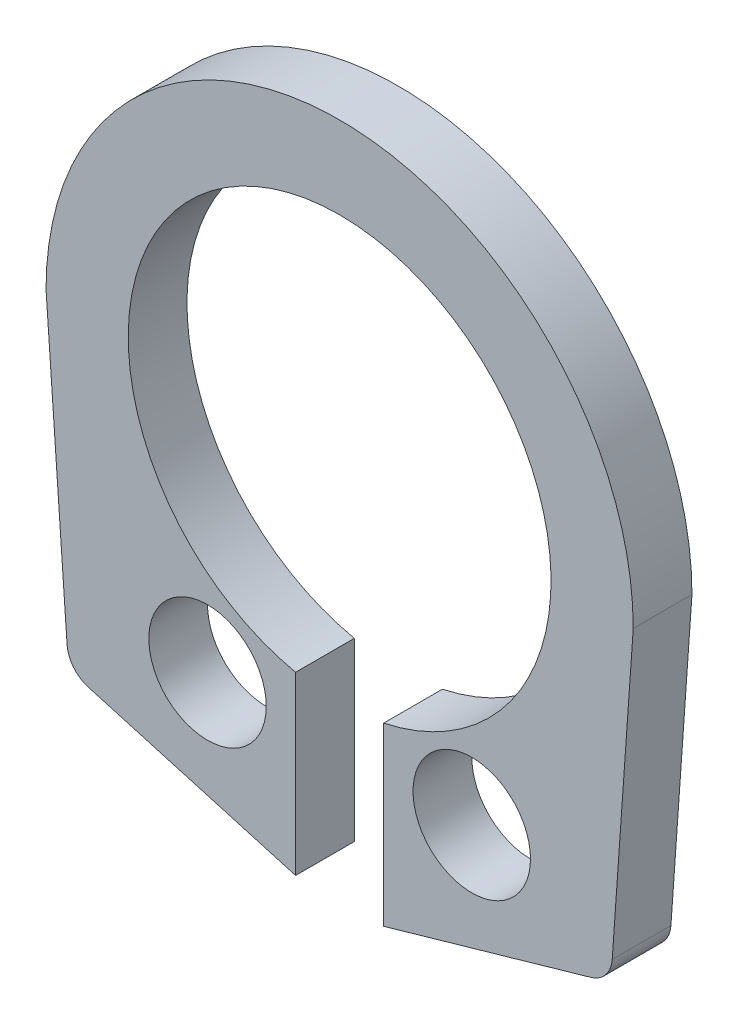
ISO-10303-21;
HEADER;
FILE_DESCRIPTION(('STEP AP214'),'2;1');
FILE_NAME('part.step','',(''),(''),'','','');
FILE_SCHEMA(('AUTOMOTIVE_DESIGN { 1 0 10303 214 1 1 1 1 }'));
ENDSEC;
DATA;
#1=APPLICATION_CONTEXT('core data for automotive mechanical design processes');
#2=APPLICATION_PROTOCOL_DEFINITION('international standard','automotive_design',2000,#1);
#3=PRODUCT_CONTEXT('',#1,'mechanical');
#4=PRODUCT('Part','Part','',(#3));
#5=PRODUCT_RELATED_PRODUCT_CATEGORY('part','',(#4));
#6=PRODUCT_DEFINITION_FORMATION('','',#4);
#7=PRODUCT_DEFINITION_CONTEXT('part definition',#1,'design');
#8=PRODUCT_DEFINITION('design','',#6,#7);
#9=PRODUCT_DEFINITION_SHAPE('','',#8);
#10=(LENGTH_UNIT() NAMED_UNIT(*) SI_UNIT(.MILLI.,.METRE.));
#11=(NAMED_UNIT(*) PLANE_ANGLE_UNIT() SI_UNIT($,.RADIAN.));
#12=(NAMED_UNIT(*) SI_UNIT($,.STERADIAN.) SOLID_ANGLE_UNIT());
#13=UNCERTAINTY_MEASURE_WITH_UNIT(LENGTH_MEASURE(1.E-05),#10,'distance_accuracy_value','');
#14=(GEOMETRIC_REPRESENTATION_CONTEXT(3) GLOBAL_UNCERTAINTY_ASSIGNED_CONTEXT((#13)) GLOBAL_UNIT_ASSIGNED_CONTEXT((#10,
#11,#12)) REPRESENTATION_CONTEXT('',''));
#15=CARTESIAN_POINT('',(0.,0.,0.));
#16=DIRECTION('',(0.,0.,1.));
#17=DIRECTION('',(1.,0.,0.));
#18=AXIS2_PLACEMENT_3D('',#15,#16,#17);
#19=CARTESIAN_POINT('',(0.,-0.57748458599427,1.));
#20=DIRECTION('',(0.,0.,-1.));
#21=DIRECTION('',(-1.,0.,0.));
#22=AXIS2_PLACEMENT_3D('',#19,#20,#21);
#23=CYLINDRICAL_SURFACE('',#22,5.);
#24=CARTESIAN_POINT('',(0.,-0.57748458599427,0.));
#25=DIRECTION('',(0.,0.,1.));
#26=DIRECTION('',(1.,0.,0.));
#27=AXIS2_PLACEMENT_3D('',#24,#25,#26);
#28=CIRCLE('',#27,5.);
#29=CARTESIAN_POINT('',(5.,-0.577484585994269,0.));
#30=VERTEX_POINT('',#29);
#31=CARTESIAN_POINT('',(-5.,-0.57748458599427,0.));
#32=VERTEX_POINT('',#31);
#33=EDGE_CURVE('E130',#30,#32,#28,.T.);
#34=ORIENTED_EDGE('',*,*,#33,.T.);
#35=DIRECTION('',(0.,0.,-1.));
#36=VECTOR('',#35,1.);
#37=CARTESIAN_POINT('',(-5.,-0.57748458599427,1.));
#38=LINE('',#37,#36);
#39=CARTESIAN_POINT('',(-5.,-0.57748458599427,1.));
#40=VERTEX_POINT('',#39);
#41=EDGE_CURVE('E114',#40,#32,#38,.T.);
#42=ORIENTED_EDGE('',*,*,#41,.F.);
#43=CARTESIAN_POINT('',(0.,-0.57748458599427,1.));
#44=DIRECTION('',(0.,0.,1.));
#45=DIRECTION('',(1.,0.,0.));
#46=AXIS2_PLACEMENT_3D('',#43,#44,#45);
#47=CIRCLE('',#46,5.);
#48=CARTESIAN_POINT('',(5.,-0.577484585994269,1.));
#49=VERTEX_POINT('',#48);
#50=EDGE_CURVE('E117',#49,#40,#47,.T.);
#51=ORIENTED_EDGE('',*,*,#50,.F.);
#52=DIRECTION('',(0.,0.,-1.));
#53=VECTOR('',#52,1.);
#54=CARTESIAN_POINT('',(5.,-0.577484585994269,1.));
#55=LINE('',#54,#53);
#56=EDGE_CURVE('E183',#49,#30,#55,.T.);
#57=ORIENTED_EDGE('',*,*,#56,.T.);
#58=EDGE_LOOP('',(#34,#42,#51,#57));
#59=FACE_BOUND('',#58,.T.);
#60=ADVANCED_FACE('F36',(#59),#23,.T.);
#61=CARTESIAN_POINT('',(-5.01574296399737,-0.355145989151535,1.));
#62=DIRECTION('',(0.997502623514453,0.0706294278738239,0.));
#63=DIRECTION('',(-0.0706294278738239,0.997502623514453,0.));
#64=AXIS2_PLACEMENT_3D('',#61,#62,#63);
#65=PLANE('',#64);
#66=DIRECTION('',(0.0706294278738239,-0.997502623514453,0.));
#67=VECTOR('',#66,1.);
#68=CARTESIAN_POINT('',(-5.01574296399737,-0.355145989151535,0.));
#69=LINE('',#68,#67);
#70=CARTESIAN_POINT('',(-4.64162801158522,-5.63878848437008,0.));
#71=VERTEX_POINT('',#70);
#72=EDGE_CURVE('E165',#32,#71,#69,.T.);
#73=ORIENTED_EDGE('',*,*,#72,.T.);
#74=DIRECTION('',(0.,0.,-1.));
#75=VECTOR('',#74,1.);
#76=CARTESIAN_POINT('',(-4.64162801158522,-5.63878848437008,1.));
#77=LINE('',#76,#75);
#78=CARTESIAN_POINT('',(-4.64162801158522,-5.63878848437008,1.));
#79=VERTEX_POINT('',#78);
#80=EDGE_CURVE('E11',#71,#79,#77,.F.);
#81=ORIENTED_EDGE('',*,*,#80,.T.);
#82=DIRECTION('',(0.0706294278738239,-0.997502623514453,0.));
#83=VECTOR('',#82,1.);
#84=CARTESIAN_POINT('',(-5.01574296399737,-0.355145989151535,1.));
#85=LINE('',#84,#83);
#86=EDGE_CURVE('E110',#40,#79,#85,.T.);
#87=ORIENTED_EDGE('',*,*,#86,.F.);
#88=ORIENTED_EDGE('',*,*,#41,.T.);
#89=EDGE_LOOP('',(#73,#81,#87,#88));
#90=FACE_BOUND('',#89,.T.);
#91=ADVANCED_FACE('F112',(#90),#65,.F.);
#92=CARTESIAN_POINT('',(-1.93596298569845,-6.75599865087569,1.));
#93=DIRECTION('',(0.275467946588921,0.961310257098135,0.));
#94=DIRECTION('',(-0.961310257098135,0.275467946588921,0.));
#95=AXIS2_PLACEMENT_3D('',#92,#93,#94);
#96=PLANE('',#95);
#97=DIRECTION('',(0.961310257098135,-0.275467946588921,0.));
#98=VECTOR('',#97,1.);
#99=CARTESIAN_POINT('',(-1.93596298569845,-6.75599865087569,1.));
#100=LINE('',#99,#98);
#101=CARTESIAN_POINT('',(-4.28061067312245,-6.08412889898224,1.));
#102=VERTEX_POINT('',#101);
#103=CARTESIAN_POINT('',(-0.749999999999999,-7.09584188669738,1.));
#104=VERTEX_POINT('',#103);
#105=EDGE_CURVE('E116',#102,#104,#100,.T.);
#106=ORIENTED_EDGE('',*,*,#105,.F.);
#107=DIRECTION('',(0.,0.,-1.));
#108=VECTOR('',#107,1.);
#109=CARTESIAN_POINT('',(-4.28061067312245,-6.08412889898224,1.));
#110=LINE('',#109,#108);
#111=CARTESIAN_POINT('',(-4.28061067312245,-6.08412889898224,0.));
#112=VERTEX_POINT('',#111);
#113=EDGE_CURVE('E44',#102,#112,#110,.T.);
#114=ORIENTED_EDGE('',*,*,#113,.T.);
#115=DIRECTION('',(0.961310257098135,-0.275467946588921,0.));
#116=VECTOR('',#115,1.);
#117=CARTESIAN_POINT('',(-1.93596298569845,-6.75599865087569,0.));
#118=LINE('',#117,#116);
#119=CARTESIAN_POINT('',(-0.749999999999999,-7.09584188669738,0.));
#120=VERTEX_POINT('',#119);
#121=EDGE_CURVE('E155',#112,#120,#118,.T.);
#122=ORIENTED_EDGE('',*,*,#121,.T.);
#123=DIRECTION('',(0.,0.,-1.));
#124=VECTOR('',#123,1.);
#125=CARTESIAN_POINT('',(-0.749999999999999,-7.09584188669738,1.));
#126=LINE('',#125,#124);
#127=EDGE_CURVE('E132',#104,#120,#126,.T.);
#128=ORIENTED_EDGE('',*,*,#127,.F.);
#129=EDGE_LOOP('',(#106,#114,#122,#128));
#130=FACE_BOUND('',#129,.T.);
#131=ADVANCED_FACE('F153',(#130),#96,.F.);
#132=CARTESIAN_POINT('',(-0.749999999999995,0.,1.));
#133=DIRECTION('',(-1.,0.,0.));
#134=DIRECTION('',(0.,-1.,0.));
#135=AXIS2_PLACEMENT_3D('',#132,#133,#134);
#136=PLANE('',#135);
#137=DIRECTION('',(0.,1.,0.));
#138=VECTOR('',#137,1.);
#139=CARTESIAN_POINT('',(-0.749999999999995,0.,0.));
#140=LINE('',#139,#138);
#141=CARTESIAN_POINT('',(-0.749999999999998,-4.09849296428592,0.));
#142=VERTEX_POINT('',#141);
#143=EDGE_CURVE('E164',#120,#142,#140,.T.);
#144=ORIENTED_EDGE('',*,*,#143,.T.);
#145=DIRECTION('',(0.,0.,-1.));
#146=VECTOR('',#145,1.);
#147=CARTESIAN_POINT('',(-0.749999999999998,-4.09849296428592,1.));
#148=LINE('',#147,#146);
#149=CARTESIAN_POINT('',(-0.749999999999998,-4.09849296428592,1.));
#150=VERTEX_POINT('',#149);
#151=EDGE_CURVE('E138',#150,#142,#148,.T.);
#152=ORIENTED_EDGE('',*,*,#151,.F.);
#153=DIRECTION('',(0.,1.,0.));
#154=VECTOR('',#153,1.);
#155=CARTESIAN_POINT('',(-0.749999999999995,0.,1.));
#156=LINE('',#155,#154);
#157=EDGE_CURVE('E208',#104,#150,#156,.T.);
#158=ORIENTED_EDGE('',*,*,#157,.F.);
#159=ORIENTED_EDGE('',*,*,#127,.T.);
#160=EDGE_LOOP('',(#144,#152,#158,#159));
#161=FACE_BOUND('',#160,.T.);
#162=ADVANCED_FACE('F199',(#161),#136,.F.);
#163=CARTESIAN_POINT('',(0.,-0.57748458599427,1.));
#164=DIRECTION('',(0.,0.,-1.));
#165=DIRECTION('',(-1.,0.,0.));
#166=AXIS2_PLACEMENT_3D('',#163,#164,#165);
#167=CYLINDRICAL_SURFACE('',#166,3.6);
#168=CARTESIAN_POINT('',(0.,-0.57748458599427,0.));
#169=DIRECTION('',(0.,0.,1.));
#170=DIRECTION('',(1.,0.,0.));
#171=AXIS2_PLACEMENT_3D('',#168,#169,#170);
#172=CIRCLE('',#171,3.6);
#173=CARTESIAN_POINT('',(0.750000000000001,-4.09849296428592,0.));
#174=VERTEX_POINT('',#173);
#175=EDGE_CURVE('E167',#174,#142,#172,.T.);
#176=ORIENTED_EDGE('',*,*,#175,.F.);
#177=DIRECTION('',(0.,0.,-1.));
#178=VECTOR('',#177,1.);
#179=CARTESIAN_POINT('',(0.750000000000001,-4.09849296428592,1.));
#180=LINE('',#179,#178);
#181=CARTESIAN_POINT('',(0.750000000000001,-4.09849296428592,1.));
#182=VERTEX_POINT('',#181);
#183=EDGE_CURVE('E189',#182,#174,#180,.T.);
#184=ORIENTED_EDGE('',*,*,#183,.F.);
#185=CARTESIAN_POINT('',(0.,-0.57748458599427,1.));
#186=DIRECTION('',(0.,0.,1.));
#187=DIRECTION('',(1.,0.,0.));
#188=AXIS2_PLACEMENT_3D('',#185,#186,#187);
#189=CIRCLE('',#188,3.6);
#190=EDGE_CURVE('E196',#182,#150,#189,.T.);
#191=ORIENTED_EDGE('',*,*,#190,.T.);
#192=ORIENTED_EDGE('',*,*,#151,.T.);
#193=EDGE_LOOP('',(#176,#184,#191,#192));
#194=FACE_BOUND('',#193,.T.);
#195=ADVANCED_FACE('F194',(#194),#167,.F.);
#196=CARTESIAN_POINT('',(0.75,0.,1.));
#197=DIRECTION('',(-1.,0.,0.));
#198=DIRECTION('',(0.,-1.,0.));
#199=AXIS2_PLACEMENT_3D('',#196,#197,#198);
#200=PLANE('',#199);
#201=DIRECTION('',(0.,1.,0.));
#202=VECTOR('',#201,1.);
#203=CARTESIAN_POINT('',(0.75,0.,0.));
#204=LINE('',#203,#202);
#205=CARTESIAN_POINT('',(0.749999999999999,-7.09584188669738,0.));
#206=VERTEX_POINT('',#205);
#207=EDGE_CURVE('E173',#206,#174,#204,.T.);
#208=ORIENTED_EDGE('',*,*,#207,.F.);
#209=DIRECTION('',(0.,0.,-1.));
#210=VECTOR('',#209,1.);
#211=CARTESIAN_POINT('',(0.749999999999999,-7.09584188669738,1.));
#212=LINE('',#211,#210);
#213=CARTESIAN_POINT('',(0.749999999999999,-7.09584188669738,1.));
#214=VERTEX_POINT('',#213);
#215=EDGE_CURVE('E185',#214,#206,#212,.T.);
#216=ORIENTED_EDGE('',*,*,#215,.F.);
#217=DIRECTION('',(0.,1.,0.));
#218=VECTOR('',#217,1.);
#219=CARTESIAN_POINT('',(0.75,0.,1.));
#220=LINE('',#219,#218);
#221=EDGE_CURVE('E207',#214,#182,#220,.T.);
#222=ORIENTED_EDGE('',*,*,#221,.T.);
#223=ORIENTED_EDGE('',*,*,#183,.T.);
#224=EDGE_LOOP('',(#208,#216,#222,#223));
#225=FACE_BOUND('',#224,.T.);
#226=ADVANCED_FACE('F204',(#225),#200,.T.);
#227=CARTESIAN_POINT('',(1.93596298569845,-6.75599865087569,1.));
#228=DIRECTION('',(0.275467946588921,-0.961310257098135,0.));
#229=DIRECTION('',(0.961310257098135,0.275467946588921,0.));
#230=AXIS2_PLACEMENT_3D('',#227,#228,#229);
#231=PLANE('',#230);
#232=DIRECTION('',(-0.961310257098135,-0.275467946588921,0.));
#233=VECTOR('',#232,1.);
#234=CARTESIAN_POINT('',(1.93596298569845,-6.75599865087569,0.));
#235=LINE('',#234,#233);
#236=CARTESIAN_POINT('',(4.28061067312245,-6.08412889898224,0.));
#237=VERTEX_POINT('',#236);
#238=EDGE_CURVE('E176',#237,#206,#235,.T.);
#239=ORIENTED_EDGE('',*,*,#238,.F.);
#240=DIRECTION('',(0.,0.,-1.));
#241=VECTOR('',#240,1.);
#242=CARTESIAN_POINT('',(4.28061067312245,-6.08412889898224,1.));
#243=LINE('',#242,#241);
#244=CARTESIAN_POINT('',(4.28061067312245,-6.08412889898224,1.));
#245=VERTEX_POINT('',#244);
#246=EDGE_CURVE('E145',#237,#245,#243,.F.);
#247=ORIENTED_EDGE('',*,*,#246,.T.);
#248=DIRECTION('',(-0.961310257098135,-0.275467946588921,0.));
#249=VECTOR('',#248,1.);
#250=CARTESIAN_POINT('',(1.93596298569845,-6.75599865087569,1.));
#251=LINE('',#250,#249);
#252=EDGE_CURVE('E210',#245,#214,#251,.T.);
#253=ORIENTED_EDGE('',*,*,#252,.T.);
#254=ORIENTED_EDGE('',*,*,#215,.T.);
#255=EDGE_LOOP('',(#239,#247,#253,#254));
#256=FACE_BOUND('',#255,.T.);
#257=ADVANCED_FACE('F253',(#256),#231,.T.);
#258=CARTESIAN_POINT('',(5.01574296399737,-0.355145989151534,1.));
#259=DIRECTION('',(0.997502623514453,-0.0706294278738235,0.));
#260=DIRECTION('',(0.0706294278738235,0.997502623514453,0.));
#261=AXIS2_PLACEMENT_3D('',#258,#259,#260);
#262=PLANE('',#261);
#263=DIRECTION('',(-0.0706294278738235,-0.997502623514453,0.));
#264=VECTOR('',#263,1.);
#265=CARTESIAN_POINT('',(5.01574296399737,-0.355145989151534,1.));
#266=LINE('',#265,#264);
#267=CARTESIAN_POINT('',(4.64162801158522,-5.63878848437008,1.));
#268=VERTEX_POINT('',#267);
#269=EDGE_CURVE('E125',#49,#268,#266,.T.);
#270=ORIENTED_EDGE('',*,*,#269,.T.);
#271=DIRECTION('',(0.,0.,-1.));
#272=VECTOR('',#271,1.);
#273=CARTESIAN_POINT('',(4.64162801158522,-5.63878848437008,1.));
#274=LINE('',#273,#272);
#275=CARTESIAN_POINT('',(4.64162801158522,-5.63878848437008,0.));
#276=VERTEX_POINT('',#275);
#277=EDGE_CURVE('E131',#268,#276,#274,.T.);
#278=ORIENTED_EDGE('',*,*,#277,.T.);
#279=DIRECTION('',(-0.0706294278738235,-0.997502623514453,0.));
#280=VECTOR('',#279,1.);
#281=CARTESIAN_POINT('',(5.01574296399737,-0.355145989151534,0.));
#282=LINE('',#281,#280);
#283=EDGE_CURVE('E178',#30,#276,#282,.T.);
#284=ORIENTED_EDGE('',*,*,#283,.F.);
#285=ORIENTED_EDGE('',*,*,#56,.F.);
#286=EDGE_LOOP('',(#270,#278,#284,#285));
#287=FACE_BOUND('',#286,.T.);
#288=ADVANCED_FACE('F246',(#287),#262,.T.);
#289=CARTESIAN_POINT('',(2.25,-4.85202687553671,1.));
#290=DIRECTION('',(0.,0.,-1.));
#291=DIRECTION('',(-1.,0.,0.));
#292=AXIS2_PLACEMENT_3D('',#289,#290,#291);
#293=CYLINDRICAL_SURFACE('',#292,1.);
#294=CARTESIAN_POINT('',(2.25,-4.85202687553671,1.));
#295=DIRECTION('',(0.,0.,1.));
#296=DIRECTION('',(1.,0.,0.));
#297=AXIS2_PLACEMENT_3D('',#294,#295,#296);
#298=CIRCLE('',#297,1.);
#299=CARTESIAN_POINT('',(3.25,-4.85202687553671,1.));
#300=VERTEX_POINT('',#299);
#301=EDGE_CURVE('E127',#300,#300,#298,.F.);
#302=ORIENTED_EDGE('',*,*,#301,.F.);
#303=EDGE_LOOP('',(#302));
#304=FACE_BOUND('',#303,.T.);
#305=CARTESIAN_POINT('',(2.25,-4.85202687553671,0.));
#306=DIRECTION('',(0.,0.,1.));
#307=DIRECTION('',(1.,0.,0.));
#308=AXIS2_PLACEMENT_3D('',#305,#306,#307);
#309=CIRCLE('',#308,1.);
#310=CARTESIAN_POINT('',(3.25,-4.85202687553671,0.));
#311=VERTEX_POINT('',#310);
#312=EDGE_CURVE('E219',#311,#311,#309,.F.);
#313=ORIENTED_EDGE('',*,*,#312,.T.);
#314=EDGE_LOOP('',(#313));
#315=FACE_BOUND('',#314,.T.);
#316=ADVANCED_FACE('F223',(#304,#315),#293,.F.);
#317=CARTESIAN_POINT('',(-2.25,-4.85202687553671,1.));
#318=DIRECTION('',(0.,0.,-1.));
#319=DIRECTION('',(-1.,0.,0.));
#320=AXIS2_PLACEMENT_3D('',#317,#318,#319);
#321=CYLINDRICAL_SURFACE('',#320,1.);
#322=CARTESIAN_POINT('',(-2.25,-4.85202687553671,1.));
#323=DIRECTION('',(0.,0.,1.));
#324=DIRECTION('',(1.,0.,0.));
#325=AXIS2_PLACEMENT_3D('',#322,#323,#324);
#326=CIRCLE('',#325,1.);
#327=CARTESIAN_POINT('',(-1.25,-4.85202687553671,1.));
#328=VERTEX_POINT('',#327);
#329=EDGE_CURVE('E186',#328,#328,#326,.T.);
#330=ORIENTED_EDGE('',*,*,#329,.T.);
#331=EDGE_LOOP('',(#330));
#332=FACE_BOUND('',#331,.T.);
#333=CARTESIAN_POINT('',(-2.25,-4.85202687553671,0.));
#334=DIRECTION('',(0.,0.,1.));
#335=DIRECTION('',(1.,0.,0.));
#336=AXIS2_PLACEMENT_3D('',#333,#334,#335);
#337=CIRCLE('',#336,1.);
#338=CARTESIAN_POINT('',(-1.25,-4.85202687553671,0.));
#339=VERTEX_POINT('',#338);
#340=EDGE_CURVE('E180',#339,#339,#337,.T.);
#341=ORIENTED_EDGE('',*,*,#340,.F.);
#342=EDGE_LOOP('',(#341));
#343=FACE_BOUND('',#342,.T.);
#344=ADVANCED_FACE('F233',(#332,#343),#321,.F.);
#345=CARTESIAN_POINT('',(0.,0.,1.));
#346=DIRECTION('',(0.,0.,1.));
#347=DIRECTION('',(1.,0.,0.));
#348=AXIS2_PLACEMENT_3D('',#345,#346,#347);
#349=PLANE('',#348);
#350=ORIENTED_EDGE('',*,*,#301,.T.);
#351=EDGE_LOOP('',(#350));
#352=FACE_BOUND('',#351,.T.);
#353=ORIENTED_EDGE('',*,*,#252,.F.);
#354=CARTESIAN_POINT('',(4.14287669982799,-5.60347377043317,1.));
#355=DIRECTION('',(0.,0.,1.));
#356=DIRECTION('',(1.,0.,0.));
#357=AXIS2_PLACEMENT_3D('',#354,#355,#356);
#358=CIRCLE('',#357,0.5);
#359=EDGE_CURVE('E148',#245,#268,#358,.T.);
#360=ORIENTED_EDGE('',*,*,#359,.T.);
#361=ORIENTED_EDGE('',*,*,#269,.F.);
#362=ORIENTED_EDGE('',*,*,#50,.T.);
#363=ORIENTED_EDGE('',*,*,#86,.T.);
#364=CARTESIAN_POINT('',(-4.14287669982799,-5.60347377043317,1.));
#365=DIRECTION('',(0.,0.,1.));
#366=DIRECTION('',(1.,0.,0.));
#367=AXIS2_PLACEMENT_3D('',#364,#365,#366);
#368=CIRCLE('',#367,0.5);
#369=EDGE_CURVE('E51',#79,#102,#368,.T.);
#370=ORIENTED_EDGE('',*,*,#369,.T.);
#371=ORIENTED_EDGE('',*,*,#105,.T.);
#372=ORIENTED_EDGE('',*,*,#157,.T.);
#373=ORIENTED_EDGE('',*,*,#190,.F.);
#374=ORIENTED_EDGE('',*,*,#221,.F.);
#375=EDGE_LOOP('',(#353,#360,#361,#362,#363,#370,#371,#372,#373,#374));
#376=FACE_BOUND('',#375,.T.);
#377=ORIENTED_EDGE('',*,*,#329,.F.);
#378=EDGE_LOOP('',(#377));
#379=FACE_BOUND('',#378,.T.);
#380=ADVANCED_FACE('F122',(#352,#376,#379),#349,.T.);
#381=CARTESIAN_POINT('',(0.,0.,0.));
#382=DIRECTION('',(0.,0.,1.));
#383=DIRECTION('',(1.,0.,0.));
#384=AXIS2_PLACEMENT_3D('',#381,#382,#383);
#385=PLANE('',#384);
#386=ORIENTED_EDGE('',*,*,#312,.F.);
#387=EDGE_LOOP('',(#386));
#388=FACE_BOUND('',#387,.T.);
#389=ORIENTED_EDGE('',*,*,#283,.T.);
#390=CARTESIAN_POINT('',(4.14287669982799,-5.60347377043317,0.));
#391=DIRECTION('',(0.,0.,1.));
#392=DIRECTION('',(1.,0.,0.));
#393=AXIS2_PLACEMENT_3D('',#390,#391,#392);
#394=CIRCLE('',#393,0.5);
#395=EDGE_CURVE('E143',#276,#237,#394,.F.);
#396=ORIENTED_EDGE('',*,*,#395,.T.);
#397=ORIENTED_EDGE('',*,*,#238,.T.);
#398=ORIENTED_EDGE('',*,*,#207,.T.);
#399=ORIENTED_EDGE('',*,*,#175,.T.);
#400=ORIENTED_EDGE('',*,*,#143,.F.);
#401=ORIENTED_EDGE('',*,*,#121,.F.);
#402=CARTESIAN_POINT('',(-4.14287669982799,-5.60347377043317,0.));
#403=DIRECTION('',(0.,0.,1.));
#404=DIRECTION('',(1.,0.,0.));
#405=AXIS2_PLACEMENT_3D('',#402,#403,#404);
#406=CIRCLE('',#405,0.5);
#407=EDGE_CURVE('E135',#112,#71,#406,.F.);
#408=ORIENTED_EDGE('',*,*,#407,.T.);
#409=ORIENTED_EDGE('',*,*,#72,.F.);
#410=ORIENTED_EDGE('',*,*,#33,.F.);
#411=EDGE_LOOP('',(#389,#396,#397,#398,#399,#400,#401,#408,#409,#410));
#412=FACE_BOUND('',#411,.T.);
#413=ORIENTED_EDGE('',*,*,#340,.T.);
#414=EDGE_LOOP('',(#413));
#415=FACE_BOUND('',#414,.T.);
#416=ADVANCED_FACE('F160',(#388,#412,#415),#385,.F.);
#417=CARTESIAN_POINT('',(4.14287669982799,-5.60347377043317,1.));
#418=DIRECTION('',(0.,0.,-1.));
#419=DIRECTION('',(-1.,0.,0.));
#420=AXIS2_PLACEMENT_3D('',#417,#418,#419);
#421=CYLINDRICAL_SURFACE('',#420,0.5);
#422=ORIENTED_EDGE('',*,*,#359,.F.);
#423=ORIENTED_EDGE('',*,*,#246,.F.);
#424=ORIENTED_EDGE('',*,*,#395,.F.);
#425=ORIENTED_EDGE('',*,*,#277,.F.);
#426=EDGE_LOOP('',(#422,#423,#424,#425));
#427=FACE_BOUND('',#426,.T.);
#428=ADVANCED_FACE('F226',(#427),#421,.T.);
#429=CARTESIAN_POINT('',(-4.14287669982799,-5.60347377043317,1.));
#430=DIRECTION('',(0.,0.,-1.));
#431=DIRECTION('',(-1.,0.,0.));
#432=AXIS2_PLACEMENT_3D('',#429,#430,#431);
#433=CYLINDRICAL_SURFACE('',#432,0.5);
#434=ORIENTED_EDGE('',*,*,#369,.F.);
#435=ORIENTED_EDGE('',*,*,#80,.F.);
#436=ORIENTED_EDGE('',*,*,#407,.F.);
#437=ORIENTED_EDGE('',*,*,#113,.F.);
#438=EDGE_LOOP('',(#434,#435,#436,#437));
#439=FACE_BOUND('',#438,.T.);
#440=ADVANCED_FACE('F38',(#439),#433,.T.);
#441=CLOSED_SHELL('',(#60,#91,#131,#162,#195,#226,#257,#288,#316,#344,#380,#416,#428,#440));
#442=MANIFOLD_SOLID_BREP('B2',#441);
#443=ADVANCED_BREP_SHAPE_REPRESENTATION('',(#18,#442),#14);
#444=SHAPE_DEFINITION_REPRESENTATION(#9,#443);
ENDSEC;
END-ISO-10303-21;
